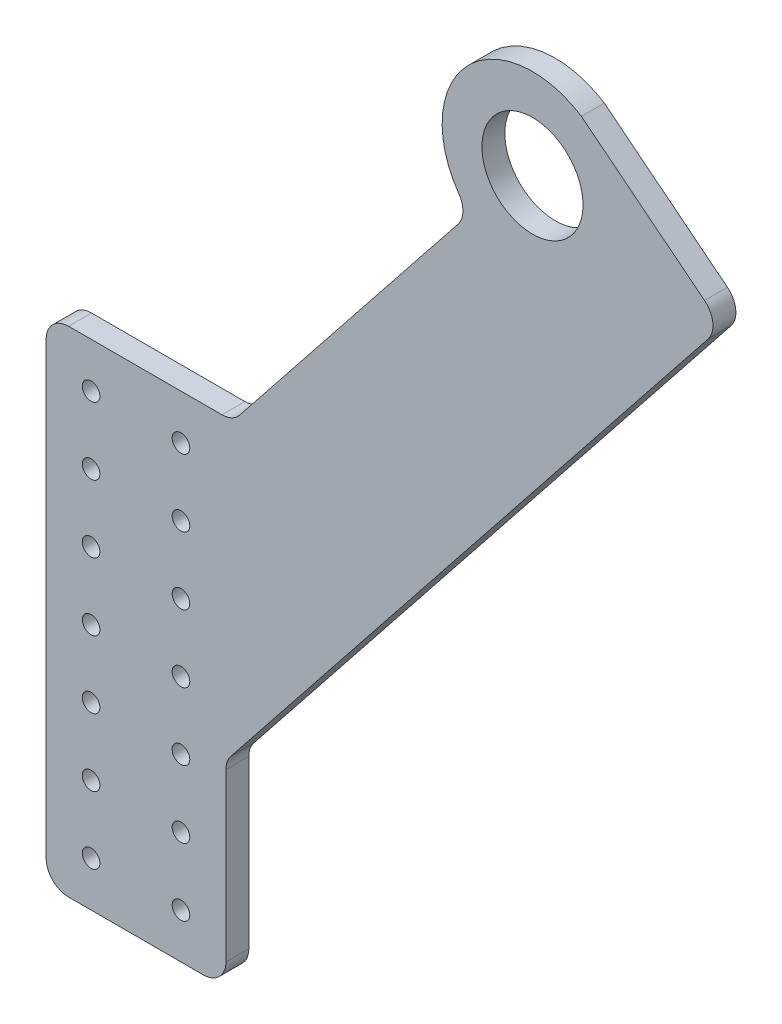
ISO-10303-21;
HEADER;
FILE_DESCRIPTION(('STEP AP214'),'2;1');
FILE_NAME('part.step','',(''),(''),'','','');
FILE_SCHEMA(('AUTOMOTIVE_DESIGN { 1 0 10303 214 1 1 1 1 }'));
ENDSEC;
DATA;
#1=APPLICATION_CONTEXT('core data for automotive mechanical design processes');
#2=APPLICATION_PROTOCOL_DEFINITION('international standard','automotive_design',2000,#1);
#3=PRODUCT_CONTEXT('',#1,'mechanical');
#4=PRODUCT('Part','Part','',(#3));
#5=PRODUCT_RELATED_PRODUCT_CATEGORY('part','',(#4));
#6=PRODUCT_DEFINITION_FORMATION('','',#4);
#7=PRODUCT_DEFINITION_CONTEXT('part definition',#1,'design');
#8=PRODUCT_DEFINITION('design','',#6,#7);
#9=PRODUCT_DEFINITION_SHAPE('','',#8);
#10=(LENGTH_UNIT() NAMED_UNIT(*) SI_UNIT(.MILLI.,.METRE.));
#11=(NAMED_UNIT(*) PLANE_ANGLE_UNIT() SI_UNIT($,.RADIAN.));
#12=(NAMED_UNIT(*) SI_UNIT($,.STERADIAN.) SOLID_ANGLE_UNIT());
#13=UNCERTAINTY_MEASURE_WITH_UNIT(LENGTH_MEASURE(1.E-05),#10,'distance_accuracy_value','');
#14=(GEOMETRIC_REPRESENTATION_CONTEXT(3) GLOBAL_UNCERTAINTY_ASSIGNED_CONTEXT((#13)) GLOBAL_UNIT_ASSIGNED_CONTEXT((#10,
#11,#12)) REPRESENTATION_CONTEXT('',''));
#15=CARTESIAN_POINT('',(0.,0.,0.));
#16=DIRECTION('',(0.,0.,1.));
#17=DIRECTION('',(1.,0.,0.));
#18=AXIS2_PLACEMENT_3D('',#15,#16,#17);
#19=CARTESIAN_POINT('',(457.2,398.526,6.477));
#20=DIRECTION('',(0.,0.,-1.));
#21=DIRECTION('',(-1.,0.,0.));
#22=AXIS2_PLACEMENT_3D('',#19,#20,#21);
#23=CYLINDRICAL_SURFACE('',#22,2.48919999999995);
#24=CARTESIAN_POINT('',(457.2,398.526,6.477));
#25=DIRECTION('',(0.,0.,1.));
#26=DIRECTION('',(1.,0.,0.));
#27=AXIS2_PLACEMENT_3D('',#24,#25,#26);
#28=CIRCLE('',#27,2.48919999999995);
#29=CARTESIAN_POINT('',(459.6892,398.526,6.477));
#30=VERTEX_POINT('',#29);
#31=EDGE_CURVE('E46',#30,#30,#28,.T.);
#32=ORIENTED_EDGE('',*,*,#31,.T.);
#33=EDGE_LOOP('',(#32));
#34=FACE_BOUND('',#33,.T.);
#35=CARTESIAN_POINT('',(457.2,398.526,0.));
#36=DIRECTION('',(0.,0.,1.));
#37=DIRECTION('',(1.,0.,0.));
#38=AXIS2_PLACEMENT_3D('',#35,#36,#37);
#39=CIRCLE('',#38,2.48919999999995);
#40=CARTESIAN_POINT('',(459.6892,398.526,0.));
#41=VERTEX_POINT('',#40);
#42=EDGE_CURVE('E11',#41,#41,#39,.T.);
#43=ORIENTED_EDGE('',*,*,#42,.F.);
#44=EDGE_LOOP('',(#43));
#45=FACE_BOUND('',#44,.T.);
#46=ADVANCED_FACE('F39',(#34,#45),#23,.F.);
#47=CARTESIAN_POINT('',(457.2,379.476,6.477));
#48=DIRECTION('',(0.,0.,-1.));
#49=DIRECTION('',(-1.,0.,0.));
#50=AXIS2_PLACEMENT_3D('',#47,#48,#49);
#51=CYLINDRICAL_SURFACE('',#50,2.48919999999995);
#52=CARTESIAN_POINT('',(457.2,379.476,6.477));
#53=DIRECTION('',(0.,0.,1.));
#54=DIRECTION('',(1.,0.,0.));
#55=AXIS2_PLACEMENT_3D('',#52,#53,#54);
#56=CIRCLE('',#55,2.48919999999995);
#57=CARTESIAN_POINT('',(459.6892,379.476,6.477));
#58=VERTEX_POINT('',#57);
#59=EDGE_CURVE('E345',#58,#58,#56,.T.);
#60=ORIENTED_EDGE('',*,*,#59,.T.);
#61=EDGE_LOOP('',(#60));
#62=FACE_BOUND('',#61,.T.);
#63=CARTESIAN_POINT('',(457.2,379.476,0.));
#64=DIRECTION('',(0.,0.,1.));
#65=DIRECTION('',(1.,0.,0.));
#66=AXIS2_PLACEMENT_3D('',#63,#64,#65);
#67=CIRCLE('',#66,2.48919999999995);
#68=CARTESIAN_POINT('',(459.6892,379.476,0.));
#69=VERTEX_POINT('',#68);
#70=EDGE_CURVE('E348',#69,#69,#67,.T.);
#71=ORIENTED_EDGE('',*,*,#70,.F.);
#72=EDGE_LOOP('',(#71));
#73=FACE_BOUND('',#72,.T.);
#74=ADVANCED_FACE('F457',(#62,#73),#51,.F.);
#75=CARTESIAN_POINT('',(457.2,360.426,6.477));
#76=DIRECTION('',(0.,0.,-1.));
#77=DIRECTION('',(-1.,0.,0.));
#78=AXIS2_PLACEMENT_3D('',#75,#76,#77);
#79=CYLINDRICAL_SURFACE('',#78,2.48919999999995);
#80=CARTESIAN_POINT('',(457.2,360.426,6.477));
#81=DIRECTION('',(0.,0.,1.));
#82=DIRECTION('',(1.,0.,0.));
#83=AXIS2_PLACEMENT_3D('',#80,#81,#82);
#84=CIRCLE('',#83,2.48919999999995);
#85=CARTESIAN_POINT('',(459.6892,360.426,6.477));
#86=VERTEX_POINT('',#85);
#87=EDGE_CURVE('E339',#86,#86,#84,.T.);
#88=ORIENTED_EDGE('',*,*,#87,.T.);
#89=EDGE_LOOP('',(#88));
#90=FACE_BOUND('',#89,.T.);
#91=CARTESIAN_POINT('',(457.2,360.426,0.));
#92=DIRECTION('',(0.,0.,1.));
#93=DIRECTION('',(1.,0.,0.));
#94=AXIS2_PLACEMENT_3D('',#91,#92,#93);
#95=CIRCLE('',#94,2.48919999999995);
#96=CARTESIAN_POINT('',(459.6892,360.426,0.));
#97=VERTEX_POINT('',#96);
#98=EDGE_CURVE('E342',#97,#97,#95,.T.);
#99=ORIENTED_EDGE('',*,*,#98,.F.);
#100=EDGE_LOOP('',(#99));
#101=FACE_BOUND('',#100,.T.);
#102=ADVANCED_FACE('F461',(#90,#101),#79,.F.);
#103=CARTESIAN_POINT('',(457.2,341.376,6.477));
#104=DIRECTION('',(0.,0.,-1.));
#105=DIRECTION('',(-1.,0.,0.));
#106=AXIS2_PLACEMENT_3D('',#103,#104,#105);
#107=CYLINDRICAL_SURFACE('',#106,2.48919999999995);
#108=CARTESIAN_POINT('',(457.2,341.376,6.477));
#109=DIRECTION('',(0.,0.,1.));
#110=DIRECTION('',(1.,0.,0.));
#111=AXIS2_PLACEMENT_3D('',#108,#109,#110);
#112=CIRCLE('',#111,2.48919999999995);
#113=CARTESIAN_POINT('',(459.6892,341.376,6.477));
#114=VERTEX_POINT('',#113);
#115=EDGE_CURVE('E333',#114,#114,#112,.T.);
#116=ORIENTED_EDGE('',*,*,#115,.T.);
#117=EDGE_LOOP('',(#116));
#118=FACE_BOUND('',#117,.T.);
#119=CARTESIAN_POINT('',(457.2,341.376,0.));
#120=DIRECTION('',(0.,0.,1.));
#121=DIRECTION('',(1.,0.,0.));
#122=AXIS2_PLACEMENT_3D('',#119,#120,#121);
#123=CIRCLE('',#122,2.48919999999995);
#124=CARTESIAN_POINT('',(459.6892,341.376,0.));
#125=VERTEX_POINT('',#124);
#126=EDGE_CURVE('E336',#125,#125,#123,.T.);
#127=ORIENTED_EDGE('',*,*,#126,.F.);
#128=EDGE_LOOP('',(#127));
#129=FACE_BOUND('',#128,.T.);
#130=ADVANCED_FACE('F466',(#118,#129),#107,.F.);
#131=CARTESIAN_POINT('',(457.2,322.326,6.477));
#132=DIRECTION('',(0.,0.,-1.));
#133=DIRECTION('',(-1.,0.,0.));
#134=AXIS2_PLACEMENT_3D('',#131,#132,#133);
#135=CYLINDRICAL_SURFACE('',#134,2.48919999999995);
#136=CARTESIAN_POINT('',(457.2,322.326,6.477));
#137=DIRECTION('',(0.,0.,1.));
#138=DIRECTION('',(1.,0.,0.));
#139=AXIS2_PLACEMENT_3D('',#136,#137,#138);
#140=CIRCLE('',#139,2.48919999999995);
#141=CARTESIAN_POINT('',(459.6892,322.326,6.477));
#142=VERTEX_POINT('',#141);
#143=EDGE_CURVE('E327',#142,#142,#140,.T.);
#144=ORIENTED_EDGE('',*,*,#143,.T.);
#145=EDGE_LOOP('',(#144));
#146=FACE_BOUND('',#145,.T.);
#147=CARTESIAN_POINT('',(457.2,322.326,0.));
#148=DIRECTION('',(0.,0.,1.));
#149=DIRECTION('',(1.,0.,0.));
#150=AXIS2_PLACEMENT_3D('',#147,#148,#149);
#151=CIRCLE('',#150,2.48919999999995);
#152=CARTESIAN_POINT('',(459.6892,322.326,0.));
#153=VERTEX_POINT('',#152);
#154=EDGE_CURVE('E330',#153,#153,#151,.T.);
#155=ORIENTED_EDGE('',*,*,#154,.F.);
#156=EDGE_LOOP('',(#155));
#157=FACE_BOUND('',#156,.T.);
#158=ADVANCED_FACE('F473',(#146,#157),#135,.F.);
#159=CARTESIAN_POINT('',(457.2,303.276,6.477));
#160=DIRECTION('',(0.,0.,-1.));
#161=DIRECTION('',(-1.,0.,0.));
#162=AXIS2_PLACEMENT_3D('',#159,#160,#161);
#163=CYLINDRICAL_SURFACE('',#162,2.48919999999995);
#164=CARTESIAN_POINT('',(457.2,303.276,6.477));
#165=DIRECTION('',(0.,0.,1.));
#166=DIRECTION('',(1.,0.,0.));
#167=AXIS2_PLACEMENT_3D('',#164,#165,#166);
#168=CIRCLE('',#167,2.48919999999995);
#169=CARTESIAN_POINT('',(459.6892,303.276,6.477));
#170=VERTEX_POINT('',#169);
#171=EDGE_CURVE('E321',#170,#170,#168,.T.);
#172=ORIENTED_EDGE('',*,*,#171,.T.);
#173=EDGE_LOOP('',(#172));
#174=FACE_BOUND('',#173,.T.);
#175=CARTESIAN_POINT('',(457.2,303.276,0.));
#176=DIRECTION('',(0.,0.,1.));
#177=DIRECTION('',(1.,0.,0.));
#178=AXIS2_PLACEMENT_3D('',#175,#176,#177);
#179=CIRCLE('',#178,2.48919999999995);
#180=CARTESIAN_POINT('',(459.6892,303.276,0.));
#181=VERTEX_POINT('',#180);
#182=EDGE_CURVE('E324',#181,#181,#179,.T.);
#183=ORIENTED_EDGE('',*,*,#182,.F.);
#184=EDGE_LOOP('',(#183));
#185=FACE_BOUND('',#184,.T.);
#186=ADVANCED_FACE('F477',(#174,#185),#163,.F.);
#187=CARTESIAN_POINT('',(457.2,284.226,6.477));
#188=DIRECTION('',(0.,0.,-1.));
#189=DIRECTION('',(-1.,0.,0.));
#190=AXIS2_PLACEMENT_3D('',#187,#188,#189);
#191=CYLINDRICAL_SURFACE('',#190,2.48919999999995);
#192=CARTESIAN_POINT('',(457.2,284.226,6.477));
#193=DIRECTION('',(0.,0.,1.));
#194=DIRECTION('',(1.,0.,0.));
#195=AXIS2_PLACEMENT_3D('',#192,#193,#194);
#196=CIRCLE('',#195,2.48919999999995);
#197=CARTESIAN_POINT('',(459.6892,284.226,6.477));
#198=VERTEX_POINT('',#197);
#199=EDGE_CURVE('E315',#198,#198,#196,.T.);
#200=ORIENTED_EDGE('',*,*,#199,.T.);
#201=EDGE_LOOP('',(#200));
#202=FACE_BOUND('',#201,.T.);
#203=CARTESIAN_POINT('',(457.2,284.226,0.));
#204=DIRECTION('',(0.,0.,1.));
#205=DIRECTION('',(1.,0.,0.));
#206=AXIS2_PLACEMENT_3D('',#203,#204,#205);
#207=CIRCLE('',#206,2.48919999999995);
#208=CARTESIAN_POINT('',(459.6892,284.226,0.));
#209=VERTEX_POINT('',#208);
#210=EDGE_CURVE('E318',#209,#209,#207,.T.);
#211=ORIENTED_EDGE('',*,*,#210,.F.);
#212=EDGE_LOOP('',(#211));
#213=FACE_BOUND('',#212,.T.);
#214=ADVANCED_FACE('F481',(#202,#213),#191,.F.);
#215=CARTESIAN_POINT('',(431.8,398.526,6.477));
#216=DIRECTION('',(0.,0.,-1.));
#217=DIRECTION('',(-1.,0.,0.));
#218=AXIS2_PLACEMENT_3D('',#215,#216,#217);
#219=CYLINDRICAL_SURFACE('',#218,2.48919999999995);
#220=CARTESIAN_POINT('',(431.8,398.526,6.477));
#221=DIRECTION('',(0.,0.,1.));
#222=DIRECTION('',(1.,0.,0.));
#223=AXIS2_PLACEMENT_3D('',#220,#221,#222);
#224=CIRCLE('',#223,2.48919999999995);
#225=CARTESIAN_POINT('',(434.2892,398.526,6.477));
#226=VERTEX_POINT('',#225);
#227=EDGE_CURVE('E309',#226,#226,#224,.T.);
#228=ORIENTED_EDGE('',*,*,#227,.T.);
#229=EDGE_LOOP('',(#228));
#230=FACE_BOUND('',#229,.T.);
#231=CARTESIAN_POINT('',(431.8,398.526,0.));
#232=DIRECTION('',(0.,0.,1.));
#233=DIRECTION('',(1.,0.,0.));
#234=AXIS2_PLACEMENT_3D('',#231,#232,#233);
#235=CIRCLE('',#234,2.48919999999995);
#236=CARTESIAN_POINT('',(434.2892,398.526,0.));
#237=VERTEX_POINT('',#236);
#238=EDGE_CURVE('E312',#237,#237,#235,.T.);
#239=ORIENTED_EDGE('',*,*,#238,.F.);
#240=EDGE_LOOP('',(#239));
#241=FACE_BOUND('',#240,.T.);
#242=ADVANCED_FACE('F485',(#230,#241),#219,.F.);
#243=CARTESIAN_POINT('',(431.8,379.476,6.477));
#244=DIRECTION('',(0.,0.,-1.));
#245=DIRECTION('',(-1.,0.,0.));
#246=AXIS2_PLACEMENT_3D('',#243,#244,#245);
#247=CYLINDRICAL_SURFACE('',#246,2.48919999999995);
#248=CARTESIAN_POINT('',(431.8,379.476,6.477));
#249=DIRECTION('',(0.,0.,1.));
#250=DIRECTION('',(1.,0.,0.));
#251=AXIS2_PLACEMENT_3D('',#248,#249,#250);
#252=CIRCLE('',#251,2.48919999999995);
#253=CARTESIAN_POINT('',(434.2892,379.476,6.477));
#254=VERTEX_POINT('',#253);
#255=EDGE_CURVE('E303',#254,#254,#252,.T.);
#256=ORIENTED_EDGE('',*,*,#255,.T.);
#257=EDGE_LOOP('',(#256));
#258=FACE_BOUND('',#257,.T.);
#259=CARTESIAN_POINT('',(431.8,379.476,0.));
#260=DIRECTION('',(0.,0.,1.));
#261=DIRECTION('',(1.,0.,0.));
#262=AXIS2_PLACEMENT_3D('',#259,#260,#261);
#263=CIRCLE('',#262,2.48919999999995);
#264=CARTESIAN_POINT('',(434.2892,379.476,0.));
#265=VERTEX_POINT('',#264);
#266=EDGE_CURVE('E306',#265,#265,#263,.T.);
#267=ORIENTED_EDGE('',*,*,#266,.F.);
#268=EDGE_LOOP('',(#267));
#269=FACE_BOUND('',#268,.T.);
#270=ADVANCED_FACE('F489',(#258,#269),#247,.F.);
#271=CARTESIAN_POINT('',(431.8,360.426,6.477));
#272=DIRECTION('',(0.,0.,-1.));
#273=DIRECTION('',(-1.,0.,0.));
#274=AXIS2_PLACEMENT_3D('',#271,#272,#273);
#275=CYLINDRICAL_SURFACE('',#274,2.48919999999995);
#276=CARTESIAN_POINT('',(431.8,360.426,6.477));
#277=DIRECTION('',(0.,0.,1.));
#278=DIRECTION('',(1.,0.,0.));
#279=AXIS2_PLACEMENT_3D('',#276,#277,#278);
#280=CIRCLE('',#279,2.48919999999995);
#281=CARTESIAN_POINT('',(434.2892,360.426,6.477));
#282=VERTEX_POINT('',#281);
#283=EDGE_CURVE('E297',#282,#282,#280,.T.);
#284=ORIENTED_EDGE('',*,*,#283,.T.);
#285=EDGE_LOOP('',(#284));
#286=FACE_BOUND('',#285,.T.);
#287=CARTESIAN_POINT('',(431.8,360.426,0.));
#288=DIRECTION('',(0.,0.,1.));
#289=DIRECTION('',(1.,0.,0.));
#290=AXIS2_PLACEMENT_3D('',#287,#288,#289);
#291=CIRCLE('',#290,2.48919999999995);
#292=CARTESIAN_POINT('',(434.2892,360.426,0.));
#293=VERTEX_POINT('',#292);
#294=EDGE_CURVE('E300',#293,#293,#291,.T.);
#295=ORIENTED_EDGE('',*,*,#294,.F.);
#296=EDGE_LOOP('',(#295));
#297=FACE_BOUND('',#296,.T.);
#298=ADVANCED_FACE('F493',(#286,#297),#275,.F.);
#299=CARTESIAN_POINT('',(431.8,341.376,6.477));
#300=DIRECTION('',(0.,0.,-1.));
#301=DIRECTION('',(-1.,0.,0.));
#302=AXIS2_PLACEMENT_3D('',#299,#300,#301);
#303=CYLINDRICAL_SURFACE('',#302,2.48919999999995);
#304=CARTESIAN_POINT('',(431.8,341.376,6.477));
#305=DIRECTION('',(0.,0.,1.));
#306=DIRECTION('',(1.,0.,0.));
#307=AXIS2_PLACEMENT_3D('',#304,#305,#306);
#308=CIRCLE('',#307,2.48919999999995);
#309=CARTESIAN_POINT('',(434.2892,341.376,6.477));
#310=VERTEX_POINT('',#309);
#311=EDGE_CURVE('E291',#310,#310,#308,.T.);
#312=ORIENTED_EDGE('',*,*,#311,.T.);
#313=EDGE_LOOP('',(#312));
#314=FACE_BOUND('',#313,.T.);
#315=CARTESIAN_POINT('',(431.8,341.376,0.));
#316=DIRECTION('',(0.,0.,1.));
#317=DIRECTION('',(1.,0.,0.));
#318=AXIS2_PLACEMENT_3D('',#315,#316,#317);
#319=CIRCLE('',#318,2.48919999999995);
#320=CARTESIAN_POINT('',(434.2892,341.376,0.));
#321=VERTEX_POINT('',#320);
#322=EDGE_CURVE('E294',#321,#321,#319,.T.);
#323=ORIENTED_EDGE('',*,*,#322,.F.);
#324=EDGE_LOOP('',(#323));
#325=FACE_BOUND('',#324,.T.);
#326=ADVANCED_FACE('F497',(#314,#325),#303,.F.);
#327=CARTESIAN_POINT('',(431.8,322.326,6.477));
#328=DIRECTION('',(0.,0.,-1.));
#329=DIRECTION('',(-1.,0.,0.));
#330=AXIS2_PLACEMENT_3D('',#327,#328,#329);
#331=CYLINDRICAL_SURFACE('',#330,2.48919999999995);
#332=CARTESIAN_POINT('',(431.8,322.326,6.477));
#333=DIRECTION('',(0.,0.,1.));
#334=DIRECTION('',(1.,0.,0.));
#335=AXIS2_PLACEMENT_3D('',#332,#333,#334);
#336=CIRCLE('',#335,2.48919999999995);
#337=CARTESIAN_POINT('',(434.2892,322.326,6.477));
#338=VERTEX_POINT('',#337);
#339=EDGE_CURVE('E285',#338,#338,#336,.T.);
#340=ORIENTED_EDGE('',*,*,#339,.T.);
#341=EDGE_LOOP('',(#340));
#342=FACE_BOUND('',#341,.T.);
#343=CARTESIAN_POINT('',(431.8,322.326,0.));
#344=DIRECTION('',(0.,0.,1.));
#345=DIRECTION('',(1.,0.,0.));
#346=AXIS2_PLACEMENT_3D('',#343,#344,#345);
#347=CIRCLE('',#346,2.48919999999995);
#348=CARTESIAN_POINT('',(434.2892,322.326,0.));
#349=VERTEX_POINT('',#348);
#350=EDGE_CURVE('E288',#349,#349,#347,.T.);
#351=ORIENTED_EDGE('',*,*,#350,.F.);
#352=EDGE_LOOP('',(#351));
#353=FACE_BOUND('',#352,.T.);
#354=ADVANCED_FACE('F501',(#342,#353),#331,.F.);
#355=CARTESIAN_POINT('',(431.8,303.276,6.477));
#356=DIRECTION('',(0.,0.,-1.));
#357=DIRECTION('',(-1.,0.,0.));
#358=AXIS2_PLACEMENT_3D('',#355,#356,#357);
#359=CYLINDRICAL_SURFACE('',#358,2.48919999999995);
#360=CARTESIAN_POINT('',(431.8,303.276,6.477));
#361=DIRECTION('',(0.,0.,1.));
#362=DIRECTION('',(1.,0.,0.));
#363=AXIS2_PLACEMENT_3D('',#360,#361,#362);
#364=CIRCLE('',#363,2.48919999999995);
#365=CARTESIAN_POINT('',(434.2892,303.276,6.477));
#366=VERTEX_POINT('',#365);
#367=EDGE_CURVE('E279',#366,#366,#364,.T.);
#368=ORIENTED_EDGE('',*,*,#367,.T.);
#369=EDGE_LOOP('',(#368));
#370=FACE_BOUND('',#369,.T.);
#371=CARTESIAN_POINT('',(431.8,303.276,0.));
#372=DIRECTION('',(0.,0.,1.));
#373=DIRECTION('',(1.,0.,0.));
#374=AXIS2_PLACEMENT_3D('',#371,#372,#373);
#375=CIRCLE('',#374,2.48919999999995);
#376=CARTESIAN_POINT('',(434.2892,303.276,0.));
#377=VERTEX_POINT('',#376);
#378=EDGE_CURVE('E282',#377,#377,#375,.T.);
#379=ORIENTED_EDGE('',*,*,#378,.F.);
#380=EDGE_LOOP('',(#379));
#381=FACE_BOUND('',#380,.T.);
#382=ADVANCED_FACE('F505',(#370,#381),#359,.F.);
#383=CARTESIAN_POINT('',(481.693033237037,605.571137967844,6.477));
#384=DIRECTION('',(0.622514636637623,0.782608156852411,0.));
#385=DIRECTION('',(-0.782608156852411,0.622514636637623,0.));
#386=AXIS2_PLACEMENT_3D('',#383,#384,#385);
#387=PLANE('',#386);
#388=DIRECTION('',(0.782608156852411,-0.622514636637623,0.));
#389=VECTOR('',#388,1.);
#390=CARTESIAN_POINT('',(481.693033237037,605.571137967844,6.477));
#391=LINE('',#390,#389);
#392=CARTESIAN_POINT('',(570.348997206152,535.051,6.477));
#393=VERTEX_POINT('',#392);
#394=CARTESIAN_POINT('',(605.135929778242,507.380224401458,6.477));
#395=VERTEX_POINT('',#394);
#396=EDGE_CURVE('E152',#393,#395,#391,.T.);
#397=ORIENTED_EDGE('',*,*,#396,.T.);
#398=DIRECTION('',(0.,0.,-1.));
#399=VECTOR('',#398,1.);
#400=CARTESIAN_POINT('',(605.135929778242,507.380224401458,6.477));
#401=LINE('',#400,#399);
#402=CARTESIAN_POINT('',(605.135929778242,507.380224401458,0.));
#403=VERTEX_POINT('',#402);
#404=EDGE_CURVE('E227',#395,#403,#401,.T.);
#405=ORIENTED_EDGE('',*,*,#404,.T.);
#406=DIRECTION('',(0.782608156852411,-0.622514636637623,0.));
#407=VECTOR('',#406,1.);
#408=CARTESIAN_POINT('',(481.693033237037,605.571137967844,0.));
#409=LINE('',#408,#407);
#410=CARTESIAN_POINT('',(570.348997206152,535.051,0.));
#411=VERTEX_POINT('',#410);
#412=EDGE_CURVE('E155',#411,#403,#409,.T.);
#413=ORIENTED_EDGE('',*,*,#412,.F.);
#414=DIRECTION('',(0.,0.,-1.));
#415=VECTOR('',#414,1.);
#416=CARTESIAN_POINT('',(570.348997206152,535.051,6.477));
#417=LINE('',#416,#415);
#418=EDGE_CURVE('E147',#393,#411,#417,.T.);
#419=ORIENTED_EDGE('',*,*,#418,.F.);
#420=EDGE_LOOP('',(#397,#405,#413,#419));
#421=FACE_BOUND('',#420,.T.);
#422=ADVANCED_FACE('F149',(#421),#387,.T.);
#423=CARTESIAN_POINT('',(556.524950153961,513.591565638889,6.477));
#424=DIRECTION('',(0.,0.,-1.));
#425=DIRECTION('',(-1.,0.,0.));
#426=AXIS2_PLACEMENT_3D('',#423,#424,#425);
#427=CYLINDRICAL_SURFACE('',#426,25.5266840776471);
#428=CARTESIAN_POINT('',(556.524950153961,513.591565638889,0.));
#429=DIRECTION('',(0.,0.,1.));
#430=DIRECTION('',(1.,0.,0.));
#431=AXIS2_PLACEMENT_3D('',#428,#429,#430);
#432=CIRCLE('',#431,25.5266840776471);
#433=CARTESIAN_POINT('',(535.693259493966,498.838523096882,0.));
#434=VERTEX_POINT('',#433);
#435=EDGE_CURVE('E203',#411,#434,#432,.T.);
#436=ORIENTED_EDGE('',*,*,#435,.T.);
#437=DIRECTION('',(0.,0.,-1.));
#438=VECTOR('',#437,1.);
#439=CARTESIAN_POINT('',(535.693259493966,498.838523096882,6.477));
#440=LINE('',#439,#438);
#441=CARTESIAN_POINT('',(535.693259493966,498.838523096882,6.477));
#442=VERTEX_POINT('',#441);
#443=EDGE_CURVE('E166',#434,#442,#440,.F.);
#444=ORIENTED_EDGE('',*,*,#443,.T.);
#445=CARTESIAN_POINT('',(556.524950153961,513.591565638889,6.477));
#446=DIRECTION('',(0.,0.,1.));
#447=DIRECTION('',(1.,0.,0.));
#448=AXIS2_PLACEMENT_3D('',#445,#446,#447);
#449=CIRCLE('',#448,25.5266840776471);
#450=EDGE_CURVE('E163',#393,#442,#449,.T.);
#451=ORIENTED_EDGE('',*,*,#450,.F.);
#452=ORIENTED_EDGE('',*,*,#418,.T.);
#453=EDGE_LOOP('',(#436,#444,#451,#452));
#454=FACE_BOUND('',#453,.T.);
#455=ADVANCED_FACE('F164',(#454),#427,.T.);
#456=CARTESIAN_POINT('',(88.655963969116,-70.5201379678442,6.477));
#457=DIRECTION('',(-0.782608156852412,0.622514636637622,0.));
#458=DIRECTION('',(-0.622514636637622,-0.782608156852412,0.));
#459=AXIS2_PLACEMENT_3D('',#456,#457,#458);
#460=PLANE('',#459);
#461=DIRECTION('',(0.622514636637622,0.782608156852412,0.));
#462=VECTOR('',#461,1.);
#463=CARTESIAN_POINT('',(88.655963969116,-70.5201379678442,6.477));
#464=LINE('',#463,#462);
#465=CARTESIAN_POINT('',(473.760830216578,413.623032057351,6.477));
#466=VERTEX_POINT('',#465);
#467=CARTESIAN_POINT('',(535.480744554568,491.215598654722,6.477));
#468=VERTEX_POINT('',#467);
#469=EDGE_CURVE('E168',#466,#468,#464,.T.);
#470=ORIENTED_EDGE('',*,*,#469,.T.);
#471=DIRECTION('',(0.,0.,-1.));
#472=VECTOR('',#471,1.);
#473=CARTESIAN_POINT('',(535.480744554568,491.215598654721,6.477));
#474=LINE('',#473,#472);
#475=CARTESIAN_POINT('',(535.480744554568,491.215598654722,0.));
#476=VERTEX_POINT('',#475);
#477=EDGE_CURVE('E223',#468,#476,#474,.T.);
#478=ORIENTED_EDGE('',*,*,#477,.T.);
#479=DIRECTION('',(0.622514636637622,0.782608156852412,0.));
#480=VECTOR('',#479,1.);
#481=CARTESIAN_POINT('',(88.655963969116,-70.5201379678442,0.));
#482=LINE('',#481,#480);
#483=CARTESIAN_POINT('',(473.760830216578,413.623032057351,0.));
#484=VERTEX_POINT('',#483);
#485=EDGE_CURVE('E205',#484,#476,#482,.T.);
#486=ORIENTED_EDGE('',*,*,#485,.F.);
#487=DIRECTION('',(0.,0.,-1.));
#488=VECTOR('',#487,1.);
#489=CARTESIAN_POINT('',(473.760830216578,413.623032057351,6.477));
#490=LINE('',#489,#488);
#491=EDGE_CURVE('E159',#484,#466,#490,.F.);
#492=ORIENTED_EDGE('',*,*,#491,.T.);
#493=EDGE_LOOP('',(#470,#478,#486,#492));
#494=FACE_BOUND('',#493,.T.);
#495=ADVANCED_FACE('F408',(#494),#460,.T.);
#496=CARTESIAN_POINT('',(0.,411.226,6.477));
#497=DIRECTION('',(0.,-1.,0.));
#498=DIRECTION('',(0.,0.,-1.));
#499=AXIS2_PLACEMENT_3D('',#496,#497,#498);
#500=PLANE('',#499);
#501=DIRECTION('',(-1.,0.,0.));
#502=VECTOR('',#501,1.);
#503=CARTESIAN_POINT('',(0.,411.226,6.477));
#504=LINE('',#503,#502);
#505=CARTESIAN_POINT('',(468.791268420566,411.226,6.477));
#506=VERTEX_POINT('',#505);
#507=CARTESIAN_POINT('',(425.45,411.226,6.477));
#508=VERTEX_POINT('',#507);
#509=EDGE_CURVE('E183',#506,#508,#504,.T.);
#510=ORIENTED_EDGE('',*,*,#509,.F.);
#511=DIRECTION('',(0.,0.,-1.));
#512=VECTOR('',#511,1.);
#513=CARTESIAN_POINT('',(468.791268420566,411.226,6.477));
#514=LINE('',#513,#512);
#515=CARTESIAN_POINT('',(468.791268420566,411.226,0.));
#516=VERTEX_POINT('',#515);
#517=EDGE_CURVE('E254',#506,#516,#514,.T.);
#518=ORIENTED_EDGE('',*,*,#517,.T.);
#519=DIRECTION('',(-1.,0.,0.));
#520=VECTOR('',#519,1.);
#521=CARTESIAN_POINT('',(0.,411.226,0.));
#522=LINE('',#521,#520);
#523=CARTESIAN_POINT('',(425.45,411.226,0.));
#524=VERTEX_POINT('',#523);
#525=EDGE_CURVE('E208',#516,#524,#522,.T.);
#526=ORIENTED_EDGE('',*,*,#525,.T.);
#527=DIRECTION('',(0.,0.,-1.));
#528=VECTOR('',#527,1.);
#529=CARTESIAN_POINT('',(425.45,411.226,6.477));
#530=LINE('',#529,#528);
#531=EDGE_CURVE('E252',#524,#508,#530,.F.);
#532=ORIENTED_EDGE('',*,*,#531,.T.);
#533=EDGE_LOOP('',(#510,#518,#526,#532));
#534=FACE_BOUND('',#533,.T.);
#535=ADVANCED_FACE('F417',(#534),#500,.F.);
#536=CARTESIAN_POINT('',(419.1,0.,6.477));
#537=DIRECTION('',(1.,0.,0.));
#538=DIRECTION('',(0.,0.,-1.));
#539=AXIS2_PLACEMENT_3D('',#536,#537,#538);
#540=PLANE('',#539);
#541=DIRECTION('',(0.,-1.,0.));
#542=VECTOR('',#541,1.);
#543=CARTESIAN_POINT('',(419.1,0.,6.477));
#544=LINE('',#543,#542);
#545=CARTESIAN_POINT('',(419.1,404.876,6.477));
#546=VERTEX_POINT('',#545);
#547=CARTESIAN_POINT('',(419.1,277.876,6.477));
#548=VERTEX_POINT('',#547);
#549=EDGE_CURVE('E186',#546,#548,#544,.T.);
#550=ORIENTED_EDGE('',*,*,#549,.F.);
#551=DIRECTION('',(0.,0.,-1.));
#552=VECTOR('',#551,1.);
#553=CARTESIAN_POINT('',(419.1,404.876,6.477));
#554=LINE('',#553,#552);
#555=CARTESIAN_POINT('',(419.1,404.876,0.));
#556=VERTEX_POINT('',#555);
#557=EDGE_CURVE('E259',#546,#556,#554,.T.);
#558=ORIENTED_EDGE('',*,*,#557,.T.);
#559=DIRECTION('',(0.,-1.,0.));
#560=VECTOR('',#559,1.);
#561=CARTESIAN_POINT('',(419.1,0.,0.));
#562=LINE('',#561,#560);
#563=CARTESIAN_POINT('',(419.1,277.876,0.));
#564=VERTEX_POINT('',#563);
#565=EDGE_CURVE('E211',#556,#564,#562,.T.);
#566=ORIENTED_EDGE('',*,*,#565,.T.);
#567=DIRECTION('',(0.,0.,-1.));
#568=VECTOR('',#567,1.);
#569=CARTESIAN_POINT('',(419.1,277.876,6.477));
#570=LINE('',#569,#568);
#571=EDGE_CURVE('E257',#564,#548,#570,.F.);
#572=ORIENTED_EDGE('',*,*,#571,.T.);
#573=EDGE_LOOP('',(#550,#558,#566,#572));
#574=FACE_BOUND('',#573,.T.);
#575=ADVANCED_FACE('F426',(#574),#540,.F.);
#576=CARTESIAN_POINT('',(0.,271.526,6.477));
#577=DIRECTION('',(0.,-1.,0.));
#578=DIRECTION('',(0.,0.,-1.));
#579=AXIS2_PLACEMENT_3D('',#576,#577,#578);
#580=PLANE('',#579);
#581=DIRECTION('',(-1.,0.,0.));
#582=VECTOR('',#581,1.);
#583=CARTESIAN_POINT('',(0.,271.526,6.477));
#584=LINE('',#583,#582);
#585=CARTESIAN_POINT('',(463.55,271.526,6.477));
#586=VERTEX_POINT('',#585);
#587=CARTESIAN_POINT('',(425.45,271.526,6.477));
#588=VERTEX_POINT('',#587);
#589=EDGE_CURVE('E189',#586,#588,#584,.T.);
#590=ORIENTED_EDGE('',*,*,#589,.T.);
#591=DIRECTION('',(0.,0.,-1.));
#592=VECTOR('',#591,1.);
#593=CARTESIAN_POINT('',(425.45,271.526,0.));
#594=LINE('',#593,#592);
#595=CARTESIAN_POINT('',(425.45,271.526,0.));
#596=VERTEX_POINT('',#595);
#597=EDGE_CURVE('E264',#588,#596,#594,.T.);
#598=ORIENTED_EDGE('',*,*,#597,.T.);
#599=DIRECTION('',(-1.,0.,0.));
#600=VECTOR('',#599,1.);
#601=CARTESIAN_POINT('',(0.,271.526,0.));
#602=LINE('',#601,#600);
#603=CARTESIAN_POINT('',(463.55,271.526,0.));
#604=VERTEX_POINT('',#603);
#605=EDGE_CURVE('E214',#604,#596,#602,.T.);
#606=ORIENTED_EDGE('',*,*,#605,.F.);
#607=DIRECTION('',(0.,0.,-1.));
#608=VECTOR('',#607,1.);
#609=CARTESIAN_POINT('',(463.55,271.526,6.477));
#610=LINE('',#609,#608);
#611=EDGE_CURVE('E262',#604,#586,#610,.F.);
#612=ORIENTED_EDGE('',*,*,#611,.T.);
#613=EDGE_LOOP('',(#590,#598,#606,#612));
#614=FACE_BOUND('',#613,.T.);
#615=ADVANCED_FACE('F433',(#614),#580,.T.);
#616=CARTESIAN_POINT('',(469.9,0.,6.477));
#617=DIRECTION('',(-1.,0.,0.));
#618=DIRECTION('',(0.,0.,1.));
#619=AXIS2_PLACEMENT_3D('',#616,#617,#618);
#620=PLANE('',#619);
#621=DIRECTION('',(0.,1.,0.));
#622=VECTOR('',#621,1.);
#623=CARTESIAN_POINT('',(469.9,0.,0.));
#624=LINE('',#623,#622);
#625=CARTESIAN_POINT('',(469.9,277.876,0.));
#626=VERTEX_POINT('',#625);
#627=CARTESIAN_POINT('',(469.9,324.947277023116,0.));
#628=VERTEX_POINT('',#627);
#629=EDGE_CURVE('E217',#626,#628,#624,.T.);
#630=ORIENTED_EDGE('',*,*,#629,.T.);
#631=DIRECTION('',(0.,0.,-1.));
#632=VECTOR('',#631,1.);
#633=CARTESIAN_POINT('',(469.9,324.947277023116,6.477));
#634=LINE('',#633,#632);
#635=CARTESIAN_POINT('',(469.9,324.947277023116,6.477));
#636=VERTEX_POINT('',#635);
#637=EDGE_CURVE('E53',#628,#636,#634,.F.);
#638=ORIENTED_EDGE('',*,*,#637,.T.);
#639=DIRECTION('',(0.,1.,0.));
#640=VECTOR('',#639,1.);
#641=CARTESIAN_POINT('',(469.9,0.,6.477));
#642=LINE('',#641,#640);
#643=CARTESIAN_POINT('',(469.9,277.876,6.477));
#644=VERTEX_POINT('',#643);
#645=EDGE_CURVE('E192',#644,#636,#642,.T.);
#646=ORIENTED_EDGE('',*,*,#645,.F.);
#647=DIRECTION('',(0.,0.,-1.));
#648=VECTOR('',#647,1.);
#649=CARTESIAN_POINT('',(469.9,277.876,0.));
#650=LINE('',#649,#648);
#651=EDGE_CURVE('E248',#644,#626,#650,.T.);
#652=ORIENTED_EDGE('',*,*,#651,.T.);
#653=EDGE_LOOP('',(#630,#638,#646,#652));
#654=FACE_BOUND('',#653,.T.);
#655=ADVANCED_FACE('F393',(#654),#620,.F.);
#656=CARTESIAN_POINT('',(556.524950153961,513.591565638889,6.477));
#657=DIRECTION('',(0.,0.,-1.));
#658=DIRECTION('',(-1.,0.,0.));
#659=AXIS2_PLACEMENT_3D('',#656,#657,#658);
#660=CYLINDRICAL_SURFACE('',#659,14.2875);
#661=CARTESIAN_POINT('',(556.524950153961,513.591565638889,6.477));
#662=DIRECTION('',(0.,0.,1.));
#663=DIRECTION('',(1.,0.,0.));
#664=AXIS2_PLACEMENT_3D('',#661,#662,#663);
#665=CIRCLE('',#664,14.2875);
#666=CARTESIAN_POINT('',(570.812450153961,513.591565638889,6.477));
#667=VERTEX_POINT('',#666);
#668=EDGE_CURVE('E174',#667,#667,#665,.T.);
#669=ORIENTED_EDGE('',*,*,#668,.T.);
#670=EDGE_LOOP('',(#669));
#671=FACE_BOUND('',#670,.T.);
#672=CARTESIAN_POINT('',(556.524950153961,513.591565638889,0.));
#673=DIRECTION('',(0.,0.,1.));
#674=DIRECTION('',(1.,0.,0.));
#675=AXIS2_PLACEMENT_3D('',#672,#673,#674);
#676=CIRCLE('',#675,14.2875);
#677=CARTESIAN_POINT('',(570.812450153961,513.591565638889,0.));
#678=VERTEX_POINT('',#677);
#679=EDGE_CURVE('E199',#678,#678,#676,.T.);
#680=ORIENTED_EDGE('',*,*,#679,.F.);
#681=EDGE_LOOP('',(#680));
#682=FACE_BOUND('',#681,.T.);
#683=ADVANCED_FACE('F389',(#671,#682),#660,.F.);
#684=CARTESIAN_POINT('',(431.8,284.226,6.477));
#685=DIRECTION('',(0.,0.,-1.));
#686=DIRECTION('',(-1.,0.,0.));
#687=AXIS2_PLACEMENT_3D('',#684,#685,#686);
#688=CYLINDRICAL_SURFACE('',#687,2.48919999999995);
#689=CARTESIAN_POINT('',(431.8,284.226,6.477));
#690=DIRECTION('',(0.,0.,1.));
#691=DIRECTION('',(1.,0.,0.));
#692=AXIS2_PLACEMENT_3D('',#689,#690,#691);
#693=CIRCLE('',#692,2.48919999999995);
#694=CARTESIAN_POINT('',(434.2892,284.226,6.477));
#695=VERTEX_POINT('',#694);
#696=EDGE_CURVE('E177',#695,#695,#693,.T.);
#697=ORIENTED_EDGE('',*,*,#696,.T.);
#698=EDGE_LOOP('',(#697));
#699=FACE_BOUND('',#698,.T.);
#700=CARTESIAN_POINT('',(431.8,284.226,0.));
#701=DIRECTION('',(0.,0.,1.));
#702=DIRECTION('',(1.,0.,0.));
#703=AXIS2_PLACEMENT_3D('',#700,#701,#702);
#704=CIRCLE('',#703,2.48919999999995);
#705=CARTESIAN_POINT('',(434.2892,284.226,0.));
#706=VERTEX_POINT('',#705);
#707=EDGE_CURVE('E196',#706,#706,#704,.T.);
#708=ORIENTED_EDGE('',*,*,#707,.F.);
#709=EDGE_LOOP('',(#708));
#710=FACE_BOUND('',#709,.T.);
#711=ADVANCED_FACE('F392',(#699,#710),#688,.F.);
#712=CARTESIAN_POINT('',(128.412458337218,-102.143881509035,6.477));
#713=DIRECTION('',(0.782608156852411,-0.622514636637623,0.));
#714=DIRECTION('',(0.622514636637623,0.782608156852411,0.));
#715=AXIS2_PLACEMENT_3D('',#712,#713,#714);
#716=PLANE('',#715);
#717=DIRECTION('',(-0.622514636637623,-0.782608156852411,0.));
#718=VECTOR('',#717,1.);
#719=CARTESIAN_POINT('',(128.412458337218,-102.143881509035,0.));
#720=LINE('',#719,#718);
#721=CARTESIAN_POINT('',(606.152523631605,498.457694662796,0.));
#722=VERTEX_POINT('',#721);
#723=CARTESIAN_POINT('',(471.280438203987,328.900244965765,0.));
#724=VERTEX_POINT('',#723);
#725=EDGE_CURVE('E219',#722,#724,#720,.T.);
#726=ORIENTED_EDGE('',*,*,#725,.F.);
#727=DIRECTION('',(0.,0.,-1.));
#728=VECTOR('',#727,1.);
#729=CARTESIAN_POINT('',(606.152523631605,498.457694662796,6.477));
#730=LINE('',#729,#728);
#731=CARTESIAN_POINT('',(606.152523631605,498.457694662796,6.477));
#732=VERTEX_POINT('',#731);
#733=EDGE_CURVE('E240',#722,#732,#730,.F.);
#734=ORIENTED_EDGE('',*,*,#733,.T.);
#735=DIRECTION('',(-0.622514636637623,-0.782608156852411,0.));
#736=VECTOR('',#735,1.);
#737=CARTESIAN_POINT('',(128.412458337218,-102.143881509035,6.477));
#738=LINE('',#737,#736);
#739=CARTESIAN_POINT('',(471.280438203987,328.900244965765,6.477));
#740=VERTEX_POINT('',#739);
#741=EDGE_CURVE('E160',#732,#740,#738,.T.);
#742=ORIENTED_EDGE('',*,*,#741,.T.);
#743=DIRECTION('',(0.,0.,-1.));
#744=VECTOR('',#743,1.);
#745=CARTESIAN_POINT('',(471.280438203987,328.900244965765,6.477));
#746=LINE('',#745,#744);
#747=EDGE_CURVE('E237',#740,#724,#746,.T.);
#748=ORIENTED_EDGE('',*,*,#747,.T.);
#749=EDGE_LOOP('',(#726,#734,#742,#748));
#750=FACE_BOUND('',#749,.T.);
#751=ADVANCED_FACE('F358',(#750),#716,.T.);
#752=CARTESIAN_POINT('',(0.,0.,6.477));
#753=DIRECTION('',(0.,0.,1.));
#754=DIRECTION('',(1.,0.,0.));
#755=AXIS2_PLACEMENT_3D('',#752,#753,#754);
#756=PLANE('',#755);
#757=ORIENTED_EDGE('',*,*,#31,.F.);
#758=EDGE_LOOP('',(#757));
#759=FACE_BOUND('',#758,.T.);
#760=ORIENTED_EDGE('',*,*,#59,.F.);
#761=EDGE_LOOP('',(#760));
#762=FACE_BOUND('',#761,.T.);
#763=ORIENTED_EDGE('',*,*,#87,.F.);
#764=EDGE_LOOP('',(#763));
#765=FACE_BOUND('',#764,.T.);
#766=ORIENTED_EDGE('',*,*,#115,.F.);
#767=EDGE_LOOP('',(#766));
#768=FACE_BOUND('',#767,.T.);
#769=ORIENTED_EDGE('',*,*,#143,.F.);
#770=EDGE_LOOP('',(#769));
#771=FACE_BOUND('',#770,.T.);
#772=ORIENTED_EDGE('',*,*,#171,.F.);
#773=EDGE_LOOP('',(#772));
#774=FACE_BOUND('',#773,.T.);
#775=ORIENTED_EDGE('',*,*,#199,.F.);
#776=EDGE_LOOP('',(#775));
#777=FACE_BOUND('',#776,.T.);
#778=ORIENTED_EDGE('',*,*,#227,.F.);
#779=EDGE_LOOP('',(#778));
#780=FACE_BOUND('',#779,.T.);
#781=ORIENTED_EDGE('',*,*,#255,.F.);
#782=EDGE_LOOP('',(#781));
#783=FACE_BOUND('',#782,.T.);
#784=ORIENTED_EDGE('',*,*,#283,.F.);
#785=EDGE_LOOP('',(#784));
#786=FACE_BOUND('',#785,.T.);
#787=ORIENTED_EDGE('',*,*,#311,.F.);
#788=EDGE_LOOP('',(#787));
#789=FACE_BOUND('',#788,.T.);
#790=ORIENTED_EDGE('',*,*,#339,.F.);
#791=EDGE_LOOP('',(#790));
#792=FACE_BOUND('',#791,.T.);
#793=ORIENTED_EDGE('',*,*,#367,.F.);
#794=EDGE_LOOP('',(#793));
#795=FACE_BOUND('',#794,.T.);
#796=ORIENTED_EDGE('',*,*,#696,.F.);
#797=EDGE_LOOP('',(#796));
#798=FACE_BOUND('',#797,.T.);
#799=ORIENTED_EDGE('',*,*,#668,.F.);
#800=EDGE_LOOP('',(#799));
#801=FACE_BOUND('',#800,.T.);
#802=ORIENTED_EDGE('',*,*,#741,.F.);
#803=CARTESIAN_POINT('',(601.182961835593,502.410662605445,6.477));
#804=DIRECTION('',(0.,0.,1.));
#805=DIRECTION('',(1.,0.,0.));
#806=AXIS2_PLACEMENT_3D('',#803,#804,#805);
#807=CIRCLE('',#806,6.35);
#808=EDGE_CURVE('E173',#732,#395,#807,.T.);
#809=ORIENTED_EDGE('',*,*,#808,.T.);
#810=ORIENTED_EDGE('',*,*,#396,.F.);
#811=ORIENTED_EDGE('',*,*,#450,.T.);
#812=CARTESIAN_POINT('',(530.511182758555,495.16856659737,6.477));
#813=DIRECTION('',(0.,0.,1.));
#814=DIRECTION('',(1.,0.,0.));
#815=AXIS2_PLACEMENT_3D('',#812,#813,#814);
#816=CIRCLE('',#815,6.35);
#817=EDGE_CURVE('E269',#442,#468,#816,.F.);
#818=ORIENTED_EDGE('',*,*,#817,.T.);
#819=ORIENTED_EDGE('',*,*,#469,.F.);
#820=CARTESIAN_POINT('',(468.791268420566,417.576,6.477));
#821=DIRECTION('',(0.,0.,1.));
#822=DIRECTION('',(1.,0.,0.));
#823=AXIS2_PLACEMENT_3D('',#820,#821,#822);
#824=CIRCLE('',#823,6.35);
#825=EDGE_CURVE('E277',#466,#506,#824,.F.);
#826=ORIENTED_EDGE('',*,*,#825,.T.);
#827=ORIENTED_EDGE('',*,*,#509,.T.);
#828=CARTESIAN_POINT('',(425.45,404.876,6.477));
#829=DIRECTION('',(0.,0.,1.));
#830=DIRECTION('',(1.,0.,0.));
#831=AXIS2_PLACEMENT_3D('',#828,#829,#830);
#832=CIRCLE('',#831,6.35);
#833=EDGE_CURVE('E245',#508,#546,#832,.T.);
#834=ORIENTED_EDGE('',*,*,#833,.T.);
#835=ORIENTED_EDGE('',*,*,#549,.T.);
#836=CARTESIAN_POINT('',(425.45,277.876,6.477));
#837=DIRECTION('',(0.,0.,1.));
#838=DIRECTION('',(1.,0.,0.));
#839=AXIS2_PLACEMENT_3D('',#836,#837,#838);
#840=CIRCLE('',#839,6.35);
#841=EDGE_CURVE('E243',#548,#588,#840,.T.);
#842=ORIENTED_EDGE('',*,*,#841,.T.);
#843=ORIENTED_EDGE('',*,*,#589,.F.);
#844=CARTESIAN_POINT('',(463.55,277.876,6.477));
#845=DIRECTION('',(0.,0.,1.));
#846=DIRECTION('',(1.,0.,0.));
#847=AXIS2_PLACEMENT_3D('',#844,#845,#846);
#848=CIRCLE('',#847,6.35);
#849=EDGE_CURVE('E60',#586,#644,#848,.T.);
#850=ORIENTED_EDGE('',*,*,#849,.T.);
#851=ORIENTED_EDGE('',*,*,#645,.T.);
#852=CARTESIAN_POINT('',(476.25,324.947277023116,6.477));
#853=DIRECTION('',(0.,0.,1.));
#854=DIRECTION('',(1.,0.,0.));
#855=AXIS2_PLACEMENT_3D('',#852,#853,#854);
#856=CIRCLE('',#855,6.35);
#857=EDGE_CURVE('E273',#636,#740,#856,.F.);
#858=ORIENTED_EDGE('',*,*,#857,.T.);
#859=EDGE_LOOP('',(#802,#809,#810,#811,#818,#819,#826,#827,#834,#835,#842,#843,#850,#851,#858));
#860=FACE_BOUND('',#859,.T.);
#861=ADVANCED_FACE('F171',(#759,#762,#765,#768,#771,#774,#777,#780,#783,#786,#789,#792,#795,
#798,#801,#860),#756,.T.);
#862=CARTESIAN_POINT('',(0.,0.,0.));
#863=DIRECTION('',(0.,0.,1.));
#864=DIRECTION('',(1.,0.,0.));
#865=AXIS2_PLACEMENT_3D('',#862,#863,#864);
#866=PLANE('',#865);
#867=ORIENTED_EDGE('',*,*,#42,.T.);
#868=EDGE_LOOP('',(#867));
#869=FACE_BOUND('',#868,.T.);
#870=ORIENTED_EDGE('',*,*,#70,.T.);
#871=EDGE_LOOP('',(#870));
#872=FACE_BOUND('',#871,.T.);
#873=ORIENTED_EDGE('',*,*,#98,.T.);
#874=EDGE_LOOP('',(#873));
#875=FACE_BOUND('',#874,.T.);
#876=ORIENTED_EDGE('',*,*,#126,.T.);
#877=EDGE_LOOP('',(#876));
#878=FACE_BOUND('',#877,.T.);
#879=ORIENTED_EDGE('',*,*,#154,.T.);
#880=EDGE_LOOP('',(#879));
#881=FACE_BOUND('',#880,.T.);
#882=ORIENTED_EDGE('',*,*,#182,.T.);
#883=EDGE_LOOP('',(#882));
#884=FACE_BOUND('',#883,.T.);
#885=ORIENTED_EDGE('',*,*,#210,.T.);
#886=EDGE_LOOP('',(#885));
#887=FACE_BOUND('',#886,.T.);
#888=ORIENTED_EDGE('',*,*,#238,.T.);
#889=EDGE_LOOP('',(#888));
#890=FACE_BOUND('',#889,.T.);
#891=ORIENTED_EDGE('',*,*,#266,.T.);
#892=EDGE_LOOP('',(#891));
#893=FACE_BOUND('',#892,.T.);
#894=ORIENTED_EDGE('',*,*,#294,.T.);
#895=EDGE_LOOP('',(#894));
#896=FACE_BOUND('',#895,.T.);
#897=ORIENTED_EDGE('',*,*,#322,.T.);
#898=EDGE_LOOP('',(#897));
#899=FACE_BOUND('',#898,.T.);
#900=ORIENTED_EDGE('',*,*,#350,.T.);
#901=EDGE_LOOP('',(#900));
#902=FACE_BOUND('',#901,.T.);
#903=ORIENTED_EDGE('',*,*,#378,.T.);
#904=EDGE_LOOP('',(#903));
#905=FACE_BOUND('',#904,.T.);
#906=ORIENTED_EDGE('',*,*,#707,.T.);
#907=EDGE_LOOP('',(#906));
#908=FACE_BOUND('',#907,.T.);
#909=ORIENTED_EDGE('',*,*,#679,.T.);
#910=EDGE_LOOP('',(#909));
#911=FACE_BOUND('',#910,.T.);
#912=ORIENTED_EDGE('',*,*,#412,.T.);
#913=CARTESIAN_POINT('',(601.182961835593,502.410662605445,0.));
#914=DIRECTION('',(0.,0.,1.));
#915=DIRECTION('',(1.,0.,0.));
#916=AXIS2_PLACEMENT_3D('',#913,#914,#915);
#917=CIRCLE('',#916,6.35);
#918=EDGE_CURVE('E235',#403,#722,#917,.F.);
#919=ORIENTED_EDGE('',*,*,#918,.T.);
#920=ORIENTED_EDGE('',*,*,#725,.T.);
#921=CARTESIAN_POINT('',(476.25,324.947277023116,0.));
#922=DIRECTION('',(0.,0.,1.));
#923=DIRECTION('',(1.,0.,0.));
#924=AXIS2_PLACEMENT_3D('',#921,#922,#923);
#925=CIRCLE('',#924,6.35);
#926=EDGE_CURVE('E271',#724,#628,#925,.T.);
#927=ORIENTED_EDGE('',*,*,#926,.T.);
#928=ORIENTED_EDGE('',*,*,#629,.F.);
#929=CARTESIAN_POINT('',(463.55,277.876,0.));
#930=DIRECTION('',(0.,0.,1.));
#931=DIRECTION('',(1.,0.,0.));
#932=AXIS2_PLACEMENT_3D('',#929,#930,#931);
#933=CIRCLE('',#932,6.35);
#934=EDGE_CURVE('E229',#626,#604,#933,.F.);
#935=ORIENTED_EDGE('',*,*,#934,.T.);
#936=ORIENTED_EDGE('',*,*,#605,.T.);
#937=CARTESIAN_POINT('',(425.45,277.876,0.));
#938=DIRECTION('',(0.,0.,1.));
#939=DIRECTION('',(1.,0.,0.));
#940=AXIS2_PLACEMENT_3D('',#937,#938,#939);
#941=CIRCLE('',#940,6.35);
#942=EDGE_CURVE('E231',#596,#564,#941,.F.);
#943=ORIENTED_EDGE('',*,*,#942,.T.);
#944=ORIENTED_EDGE('',*,*,#565,.F.);
#945=CARTESIAN_POINT('',(425.45,404.876,0.));
#946=DIRECTION('',(0.,0.,1.));
#947=DIRECTION('',(1.,0.,0.));
#948=AXIS2_PLACEMENT_3D('',#945,#946,#947);
#949=CIRCLE('',#948,6.35);
#950=EDGE_CURVE('E233',#556,#524,#949,.F.);
#951=ORIENTED_EDGE('',*,*,#950,.T.);
#952=ORIENTED_EDGE('',*,*,#525,.F.);
#953=CARTESIAN_POINT('',(468.791268420566,417.576,0.));
#954=DIRECTION('',(0.,0.,1.));
#955=DIRECTION('',(1.,0.,0.));
#956=AXIS2_PLACEMENT_3D('',#953,#954,#955);
#957=CIRCLE('',#956,6.35);
#958=EDGE_CURVE('E275',#516,#484,#957,.T.);
#959=ORIENTED_EDGE('',*,*,#958,.T.);
#960=ORIENTED_EDGE('',*,*,#485,.T.);
#961=CARTESIAN_POINT('',(530.511182758555,495.16856659737,0.));
#962=DIRECTION('',(0.,0.,1.));
#963=DIRECTION('',(1.,0.,0.));
#964=AXIS2_PLACEMENT_3D('',#961,#962,#963);
#965=CIRCLE('',#964,6.35);
#966=EDGE_CURVE('E267',#476,#434,#965,.T.);
#967=ORIENTED_EDGE('',*,*,#966,.T.);
#968=ORIENTED_EDGE('',*,*,#435,.F.);
#969=EDGE_LOOP('',(#912,#919,#920,#927,#928,#935,#936,#943,#944,#951,#952,#959,#960,#967,#968));
#970=FACE_BOUND('',#969,.T.);
#971=ADVANCED_FACE('F357',(#869,#872,#875,#878,#881,#884,#887,#890,#893,#896,#899,#902,#905,
#908,#911,#970),#866,.F.);
#972=CARTESIAN_POINT('',(530.511182758555,495.16856659737,6.477));
#973=DIRECTION('',(0.,0.,-1.));
#974=DIRECTION('',(-1.,0.,0.));
#975=AXIS2_PLACEMENT_3D('',#972,#973,#974);
#976=CYLINDRICAL_SURFACE('',#975,6.35);
#977=ORIENTED_EDGE('',*,*,#817,.F.);
#978=ORIENTED_EDGE('',*,*,#443,.F.);
#979=ORIENTED_EDGE('',*,*,#966,.F.);
#980=ORIENTED_EDGE('',*,*,#477,.F.);
#981=EDGE_LOOP('',(#977,#978,#979,#980));
#982=FACE_BOUND('',#981,.T.);
#983=ADVANCED_FACE('F399',(#982),#976,.F.);
#984=CARTESIAN_POINT('',(601.182961835593,502.410662605445,6.477));
#985=DIRECTION('',(0.,0.,-1.));
#986=DIRECTION('',(-1.,0.,0.));
#987=AXIS2_PLACEMENT_3D('',#984,#985,#986);
#988=CYLINDRICAL_SURFACE('',#987,6.35);
#989=ORIENTED_EDGE('',*,*,#808,.F.);
#990=ORIENTED_EDGE('',*,*,#733,.F.);
#991=ORIENTED_EDGE('',*,*,#918,.F.);
#992=ORIENTED_EDGE('',*,*,#404,.F.);
#993=EDGE_LOOP('',(#989,#990,#991,#992));
#994=FACE_BOUND('',#993,.T.);
#995=ADVANCED_FACE('F447',(#994),#988,.T.);
#996=CARTESIAN_POINT('',(476.25,324.947277023116,6.477));
#997=DIRECTION('',(0.,0.,-1.));
#998=DIRECTION('',(-1.,0.,0.));
#999=AXIS2_PLACEMENT_3D('',#996,#997,#998);
#1000=CYLINDRICAL_SURFACE('',#999,6.35);
#1001=ORIENTED_EDGE('',*,*,#857,.F.);
#1002=ORIENTED_EDGE('',*,*,#637,.F.);
#1003=ORIENTED_EDGE('',*,*,#926,.F.);
#1004=ORIENTED_EDGE('',*,*,#747,.F.);
#1005=EDGE_LOOP('',(#1001,#1002,#1003,#1004));
#1006=FACE_BOUND('',#1005,.T.);
#1007=ADVANCED_FACE('F443',(#1006),#1000,.F.);
#1008=CARTESIAN_POINT('',(468.791268420566,417.576,6.477));
#1009=DIRECTION('',(0.,0.,-1.));
#1010=DIRECTION('',(-1.,0.,0.));
#1011=AXIS2_PLACEMENT_3D('',#1008,#1009,#1010);
#1012=CYLINDRICAL_SURFACE('',#1011,6.35);
#1013=ORIENTED_EDGE('',*,*,#825,.F.);
#1014=ORIENTED_EDGE('',*,*,#491,.F.);
#1015=ORIENTED_EDGE('',*,*,#958,.F.);
#1016=ORIENTED_EDGE('',*,*,#517,.F.);
#1017=EDGE_LOOP('',(#1013,#1014,#1015,#1016));
#1018=FACE_BOUND('',#1017,.T.);
#1019=ADVANCED_FACE('F412',(#1018),#1012,.F.);
#1020=CARTESIAN_POINT('',(425.45,404.876,6.477));
#1021=DIRECTION('',(0.,0.,-1.));
#1022=DIRECTION('',(-1.,0.,0.));
#1023=AXIS2_PLACEMENT_3D('',#1020,#1021,#1022);
#1024=CYLINDRICAL_SURFACE('',#1023,6.35);
#1025=ORIENTED_EDGE('',*,*,#833,.F.);
#1026=ORIENTED_EDGE('',*,*,#531,.F.);
#1027=ORIENTED_EDGE('',*,*,#950,.F.);
#1028=ORIENTED_EDGE('',*,*,#557,.F.);
#1029=EDGE_LOOP('',(#1025,#1026,#1027,#1028));
#1030=FACE_BOUND('',#1029,.T.);
#1031=ADVANCED_FACE('F421',(#1030),#1024,.T.);
#1032=CARTESIAN_POINT('',(425.45,277.876,6.477));
#1033=DIRECTION('',(0.,0.,1.));
#1034=DIRECTION('',(1.,0.,0.));
#1035=AXIS2_PLACEMENT_3D('',#1032,#1033,#1034);
#1036=CYLINDRICAL_SURFACE('',#1035,6.35);
#1037=ORIENTED_EDGE('',*,*,#841,.F.);
#1038=ORIENTED_EDGE('',*,*,#571,.F.);
#1039=ORIENTED_EDGE('',*,*,#942,.F.);
#1040=ORIENTED_EDGE('',*,*,#597,.F.);
#1041=EDGE_LOOP('',(#1037,#1038,#1039,#1040));
#1042=FACE_BOUND('',#1041,.T.);
#1043=ADVANCED_FACE('F430',(#1042),#1036,.T.);
#1044=CARTESIAN_POINT('',(463.55,277.876,6.477));
#1045=DIRECTION('',(0.,0.,1.));
#1046=DIRECTION('',(1.,0.,0.));
#1047=AXIS2_PLACEMENT_3D('',#1044,#1045,#1046);
#1048=CYLINDRICAL_SURFACE('',#1047,6.35);
#1049=ORIENTED_EDGE('',*,*,#849,.F.);
#1050=ORIENTED_EDGE('',*,*,#611,.F.);
#1051=ORIENTED_EDGE('',*,*,#934,.F.);
#1052=ORIENTED_EDGE('',*,*,#651,.F.);
#1053=EDGE_LOOP('',(#1049,#1050,#1051,#1052));
#1054=FACE_BOUND('',#1053,.T.);
#1055=ADVANCED_FACE('F437',(#1054),#1048,.T.);
#1056=CLOSED_SHELL('',(#46,#74,#102,#130,#158,#186,#214,#242,#270,#298,#326,#354,#382,#422,#455,
#495,#535,#575,#615,#655,#683,#711,#751,#861,#971,#983,#995,#1007,#1019,#1031,#1043,#1055));
#1057=MANIFOLD_SOLID_BREP('B2',#1056);
#1058=ADVANCED_BREP_SHAPE_REPRESENTATION('',(#18,#1057),#14);
#1059=SHAPE_DEFINITION_REPRESENTATION(#9,#1058);
ENDSEC;
END-ISO-10303-21;
